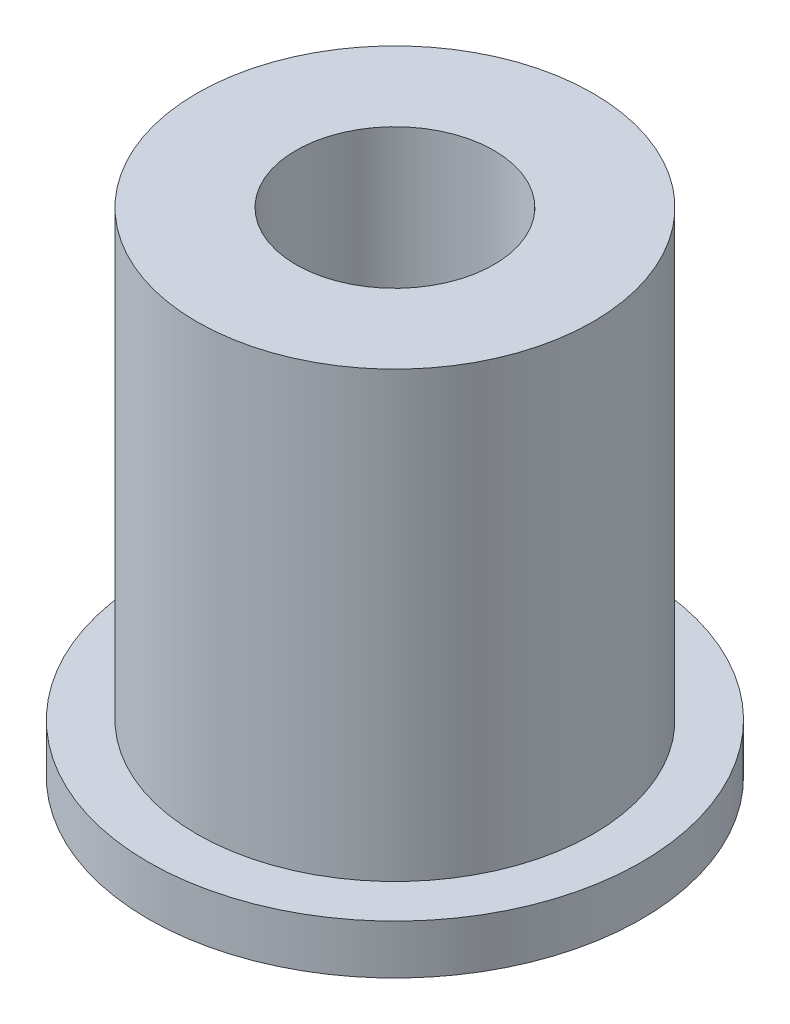
ISO-10303-21;
HEADER;
FILE_DESCRIPTION(('STEP AP214'),'2;1');
FILE_NAME('part.step','',(''),(''),'','','');
FILE_SCHEMA(('AUTOMOTIVE_DESIGN { 1 0 10303 214 1 1 1 1 }'));
ENDSEC;
DATA;
#1=APPLICATION_CONTEXT('core data for automotive mechanical design processes');
#2=APPLICATION_PROTOCOL_DEFINITION('international standard','automotive_design',2000,#1);
#3=PRODUCT_CONTEXT('',#1,'mechanical');
#4=PRODUCT('Part','Part','',(#3));
#5=PRODUCT_RELATED_PRODUCT_CATEGORY('part','',(#4));
#6=PRODUCT_DEFINITION_FORMATION('','',#4);
#7=PRODUCT_DEFINITION_CONTEXT('part definition',#1,'design');
#8=PRODUCT_DEFINITION('design','',#6,#7);
#9=PRODUCT_DEFINITION_SHAPE('','',#8);
#10=(LENGTH_UNIT() NAMED_UNIT(*) SI_UNIT(.MILLI.,.METRE.));
#11=(NAMED_UNIT(*) PLANE_ANGLE_UNIT() SI_UNIT($,.RADIAN.));
#12=(NAMED_UNIT(*) SI_UNIT($,.STERADIAN.) SOLID_ANGLE_UNIT());
#13=UNCERTAINTY_MEASURE_WITH_UNIT(LENGTH_MEASURE(1.E-05),#10,'distance_accuracy_value','');
#14=(GEOMETRIC_REPRESENTATION_CONTEXT(3) GLOBAL_UNCERTAINTY_ASSIGNED_CONTEXT((#13)) GLOBAL_UNIT_ASSIGNED_CONTEXT((#10,
#11,#12)) REPRESENTATION_CONTEXT('',''));
#15=CARTESIAN_POINT('',(0.,0.,0.));
#16=DIRECTION('',(0.,0.,1.));
#17=DIRECTION('',(1.,0.,0.));
#18=AXIS2_PLACEMENT_3D('',#15,#16,#17);
#19=CARTESIAN_POINT('',(0.,15.875,0.));
#20=DIRECTION('',(0.,1.,0.));
#21=DIRECTION('',(0.,0.,1.));
#22=AXIS2_PLACEMENT_3D('',#19,#20,#21);
#23=PLANE('',#22);
#24=CARTESIAN_POINT('',(0.,15.875,0.));
#25=DIRECTION('',(0.,1.,0.));
#26=DIRECTION('',(0.,0.,1.));
#27=AXIS2_PLACEMENT_3D('',#24,#25,#26);
#28=CIRCLE('',#27,6.3754);
#29=CARTESIAN_POINT('',(0.,15.875,6.3754));
#30=VERTEX_POINT('',#29);
#31=EDGE_CURVE('E12',#30,#30,#28,.T.);
#32=ORIENTED_EDGE('',*,*,#31,.T.);
#33=EDGE_LOOP('',(#32));
#34=FACE_BOUND('',#33,.T.);
#35=CARTESIAN_POINT('',(0.,15.875,0.));
#36=DIRECTION('',(0.,1.,0.));
#37=DIRECTION('',(0.,0.,1.));
#38=AXIS2_PLACEMENT_3D('',#35,#36,#37);
#39=CIRCLE('',#38,3.1877);
#40=CARTESIAN_POINT('',(0.,15.875,3.1877));
#41=VERTEX_POINT('',#40);
#42=EDGE_CURVE('E49',#41,#41,#39,.T.);
#43=ORIENTED_EDGE('',*,*,#42,.F.);
#44=EDGE_LOOP('',(#43));
#45=FACE_BOUND('',#44,.T.);
#46=ADVANCED_FACE('F42',(#34,#45),#23,.T.);
#47=CARTESIAN_POINT('',(0.,0.,0.));
#48=DIRECTION('',(0.,1.,0.));
#49=DIRECTION('',(0.,0.,1.));
#50=AXIS2_PLACEMENT_3D('',#47,#48,#49);
#51=PLANE('',#50);
#52=CARTESIAN_POINT('',(0.,0.,0.));
#53=DIRECTION('',(0.,1.,0.));
#54=DIRECTION('',(0.,0.,1.));
#55=AXIS2_PLACEMENT_3D('',#52,#53,#54);
#56=CIRCLE('',#55,3.1877);
#57=CARTESIAN_POINT('',(0.,0.,3.1877));
#58=VERTEX_POINT('',#57);
#59=EDGE_CURVE('E53',#58,#58,#56,.T.);
#60=ORIENTED_EDGE('',*,*,#59,.T.);
#61=EDGE_LOOP('',(#60));
#62=FACE_BOUND('',#61,.T.);
#63=CARTESIAN_POINT('',(0.,0.,0.));
#64=DIRECTION('',(0.,1.,0.));
#65=DIRECTION('',(0.,0.,1.));
#66=AXIS2_PLACEMENT_3D('',#63,#64,#65);
#67=CIRCLE('',#66,7.9375);
#68=CARTESIAN_POINT('',(0.,0.,7.9375));
#69=VERTEX_POINT('',#68);
#70=EDGE_CURVE('E60',#69,#69,#67,.T.);
#71=ORIENTED_EDGE('',*,*,#70,.F.);
#72=EDGE_LOOP('',(#71));
#73=FACE_BOUND('',#72,.T.);
#74=ADVANCED_FACE('F85',(#62,#73),#51,.F.);
#75=CARTESIAN_POINT('',(0.,15.875,0.));
#76=DIRECTION('',(0.,-1.,0.));
#77=DIRECTION('',(0.,0.,-1.));
#78=AXIS2_PLACEMENT_3D('',#75,#76,#77);
#79=CYLINDRICAL_SURFACE('',#78,6.3754);
#80=CARTESIAN_POINT('',(0.,1.5875,0.));
#81=DIRECTION('',(0.,1.,0.));
#82=DIRECTION('',(0.,0.,1.));
#83=AXIS2_PLACEMENT_3D('',#80,#81,#82);
#84=CIRCLE('',#83,6.3754);
#85=CARTESIAN_POINT('',(0.,1.5875,6.3754));
#86=VERTEX_POINT('',#85);
#87=EDGE_CURVE('E63',#86,#86,#84,.T.);
#88=ORIENTED_EDGE('',*,*,#87,.T.);
#89=EDGE_LOOP('',(#88));
#90=FACE_BOUND('',#89,.T.);
#91=ORIENTED_EDGE('',*,*,#31,.F.);
#92=EDGE_LOOP('',(#91));
#93=FACE_BOUND('',#92,.T.);
#94=ADVANCED_FACE('F44',(#90,#93),#79,.T.);
#95=CARTESIAN_POINT('',(0.,15.875,0.));
#96=DIRECTION('',(0.,-1.,0.));
#97=DIRECTION('',(0.,0.,-1.));
#98=AXIS2_PLACEMENT_3D('',#95,#96,#97);
#99=CYLINDRICAL_SURFACE('',#98,3.1877);
#100=ORIENTED_EDGE('',*,*,#42,.T.);
#101=EDGE_LOOP('',(#100));
#102=FACE_BOUND('',#101,.T.);
#103=ORIENTED_EDGE('',*,*,#59,.F.);
#104=EDGE_LOOP('',(#103));
#105=FACE_BOUND('',#104,.T.);
#106=ADVANCED_FACE('F74',(#102,#105),#99,.F.);
#107=CARTESIAN_POINT('',(0.,1.5875,0.));
#108=DIRECTION('',(0.,1.,0.));
#109=DIRECTION('',(0.,0.,1.));
#110=AXIS2_PLACEMENT_3D('',#107,#108,#109);
#111=PLANE('',#110);
#112=CARTESIAN_POINT('',(0.,1.5875,0.));
#113=DIRECTION('',(0.,1.,0.));
#114=DIRECTION('',(0.,0.,1.));
#115=AXIS2_PLACEMENT_3D('',#112,#113,#114);
#116=CIRCLE('',#115,7.9375);
#117=CARTESIAN_POINT('',(0.,1.5875,7.9375));
#118=VERTEX_POINT('',#117);
#119=EDGE_CURVE('E58',#118,#118,#116,.T.);
#120=ORIENTED_EDGE('',*,*,#119,.T.);
#121=EDGE_LOOP('',(#120));
#122=FACE_BOUND('',#121,.T.);
#123=ORIENTED_EDGE('',*,*,#87,.F.);
#124=EDGE_LOOP('',(#123));
#125=FACE_BOUND('',#124,.T.);
#126=ADVANCED_FACE('F71',(#122,#125),#111,.T.);
#127=CARTESIAN_POINT('',(0.,1.5875,0.));
#128=DIRECTION('',(0.,-1.,0.));
#129=DIRECTION('',(0.,0.,-1.));
#130=AXIS2_PLACEMENT_3D('',#127,#128,#129);
#131=CYLINDRICAL_SURFACE('',#130,7.9375);
#132=ORIENTED_EDGE('',*,*,#119,.F.);
#133=EDGE_LOOP('',(#132));
#134=FACE_BOUND('',#133,.T.);
#135=ORIENTED_EDGE('',*,*,#70,.T.);
#136=EDGE_LOOP('',(#135));
#137=FACE_BOUND('',#136,.T.);
#138=ADVANCED_FACE('F73',(#134,#137),#131,.T.);
#139=CLOSED_SHELL('',(#46,#74,#94,#106,#126,#138));
#140=MANIFOLD_SOLID_BREP('B2',#139);
#141=ADVANCED_BREP_SHAPE_REPRESENTATION('',(#18,#140),#14);
#142=SHAPE_DEFINITION_REPRESENTATION(#9,#141);
ENDSEC;
END-ISO-10303-21;
